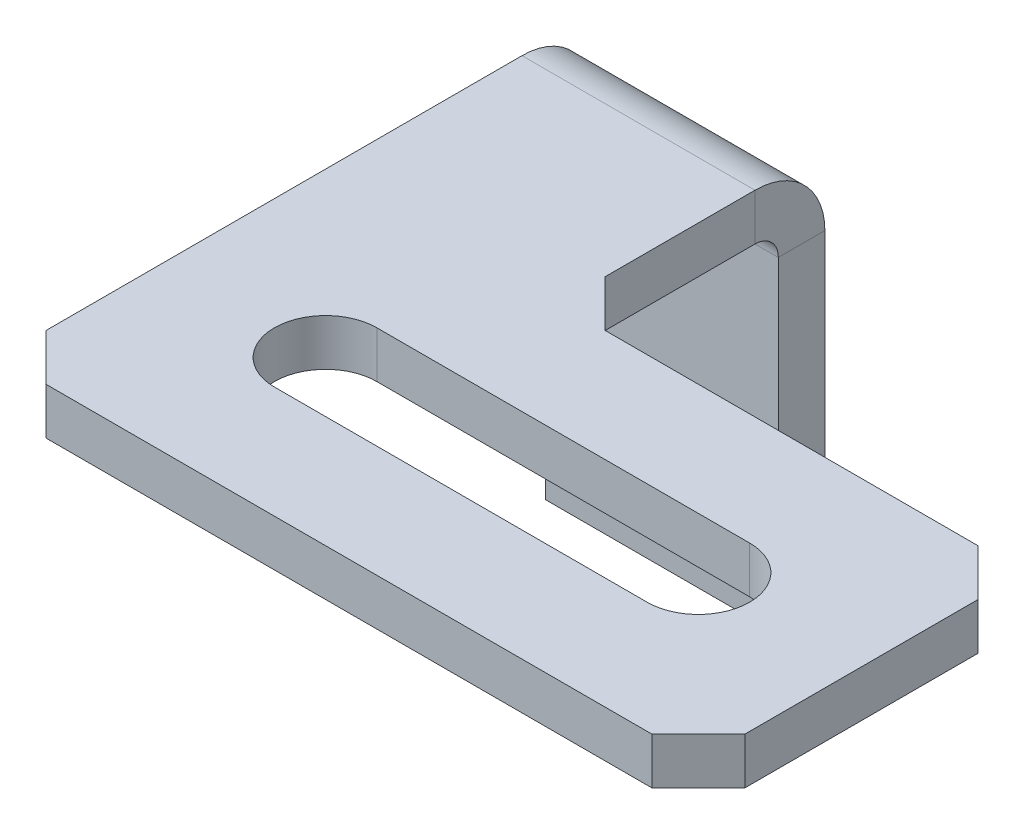
ISO-10303-21;
HEADER;
FILE_DESCRIPTION(('STEP AP214'),'2;1');
FILE_NAME('part.step','',(''),(''),'','','');
FILE_SCHEMA(('AUTOMOTIVE_DESIGN { 1 0 10303 214 1 1 1 1 }'));
ENDSEC;
DATA;
#1=APPLICATION_CONTEXT('core data for automotive mechanical design processes');
#2=APPLICATION_PROTOCOL_DEFINITION('international standard','automotive_design',2000,#1);
#3=PRODUCT_CONTEXT('',#1,'mechanical');
#4=PRODUCT('Part','Part','',(#3));
#5=PRODUCT_RELATED_PRODUCT_CATEGORY('part','',(#4));
#6=PRODUCT_DEFINITION_FORMATION('','',#4);
#7=PRODUCT_DEFINITION_CONTEXT('part definition',#1,'design');
#8=PRODUCT_DEFINITION('design','',#6,#7);
#9=PRODUCT_DEFINITION_SHAPE('','',#8);
#10=(LENGTH_UNIT() NAMED_UNIT(*) SI_UNIT(.MILLI.,.METRE.));
#11=(NAMED_UNIT(*) PLANE_ANGLE_UNIT() SI_UNIT($,.RADIAN.));
#12=(NAMED_UNIT(*) SI_UNIT($,.STERADIAN.) SOLID_ANGLE_UNIT());
#13=UNCERTAINTY_MEASURE_WITH_UNIT(LENGTH_MEASURE(1.E-05),#10,'distance_accuracy_value','');
#14=(GEOMETRIC_REPRESENTATION_CONTEXT(3) GLOBAL_UNCERTAINTY_ASSIGNED_CONTEXT((#13)) GLOBAL_UNIT_ASSIGNED_CONTEXT((#10,
#11,#12)) REPRESENTATION_CONTEXT('',''));
#15=CARTESIAN_POINT('',(0.,0.,0.));
#16=DIRECTION('',(0.,0.,1.));
#17=DIRECTION('',(1.,0.,0.));
#18=AXIS2_PLACEMENT_3D('',#15,#16,#17);
#19=CARTESIAN_POINT('',(7.5,11.2853981633974,-11.7146018366026));
#20=DIRECTION('',(0.,0.,-1.));
#21=DIRECTION('',(0.,1.,0.));
#22=AXIS2_PLACEMENT_3D('',#19,#20,#21);
#23=PLANE('',#22);
#24=DIRECTION('',(-1.,0.,0.));
#25=VECTOR('',#24,1.);
#26=CARTESIAN_POINT('',(7.5,-8.5,-11.7146018366025));
#27=LINE('',#26,#25);
#28=CARTESIAN_POINT('',(-2.5,-8.5,-11.7146018366025));
#29=VERTEX_POINT('',#28);
#30=CARTESIAN_POINT('',(-7.5,-8.5,-11.7146018366025));
#31=VERTEX_POINT('',#30);
#32=EDGE_CURVE('E141',#29,#31,#27,.T.);
#33=ORIENTED_EDGE('',*,*,#32,.F.);
#34=DIRECTION('',(0.,-1.,0.));
#35=VECTOR('',#34,1.);
#36=CARTESIAN_POINT('',(-2.5,11.2853981633974,-11.7146018366026));
#37=LINE('',#36,#35);
#38=CARTESIAN_POINT('',(-2.5,-1.5,-11.7146018366025));
#39=VERTEX_POINT('',#38);
#40=EDGE_CURVE('E149',#39,#29,#37,.T.);
#41=ORIENTED_EDGE('',*,*,#40,.F.);
#42=DIRECTION('',(-1.,0.,0.));
#43=VECTOR('',#42,1.);
#44=CARTESIAN_POINT('',(7.5,-1.5,-11.7146018366025));
#45=LINE('',#44,#43);
#46=CARTESIAN_POINT('',(-7.5,-1.5,-11.7146018366025));
#47=VERTEX_POINT('',#46);
#48=EDGE_CURVE('E166',#39,#47,#45,.T.);
#49=ORIENTED_EDGE('',*,*,#48,.T.);
#50=DIRECTION('',(0.,-1.,0.));
#51=VECTOR('',#50,1.);
#52=CARTESIAN_POINT('',(-7.5,11.2853981633974,-11.7146018366026));
#53=LINE('',#52,#51);
#54=EDGE_CURVE('E151',#47,#31,#53,.T.);
#55=ORIENTED_EDGE('',*,*,#54,.T.);
#56=EDGE_LOOP('',(#33,#41,#49,#55));
#57=FACE_BOUND('',#56,.T.);
#58=ADVANCED_FACE('F17',(#57),#23,.F.);
#59=CARTESIAN_POINT('',(7.5,11.2853981633974,-12.7146018366026));
#60=DIRECTION('',(0.,0.,-1.));
#61=DIRECTION('',(0.,1.,0.));
#62=AXIS2_PLACEMENT_3D('',#59,#60,#61);
#63=PLANE('',#62);
#64=DIRECTION('',(0.,-1.,0.));
#65=VECTOR('',#64,1.);
#66=CARTESIAN_POINT('',(-2.5,11.2853981633974,-12.7146018366026));
#67=LINE('',#66,#65);
#68=CARTESIAN_POINT('',(-2.5,-1.5,-12.7146018366025));
#69=VERTEX_POINT('',#68);
#70=CARTESIAN_POINT('',(-2.5,-8.5,-12.7146018366025));
#71=VERTEX_POINT('',#70);
#72=EDGE_CURVE('E165',#69,#71,#67,.T.);
#73=ORIENTED_EDGE('',*,*,#72,.T.);
#74=DIRECTION('',(-1.,0.,0.));
#75=VECTOR('',#74,1.);
#76=CARTESIAN_POINT('',(7.5,-8.5,-12.7146018366025));
#77=LINE('',#76,#75);
#78=CARTESIAN_POINT('',(-7.5,-8.5,-12.7146018366025));
#79=VERTEX_POINT('',#78);
#80=EDGE_CURVE('E32',#71,#79,#77,.T.);
#81=ORIENTED_EDGE('',*,*,#80,.T.);
#82=DIRECTION('',(0.,-1.,0.));
#83=VECTOR('',#82,1.);
#84=CARTESIAN_POINT('',(-7.5,-18.7146018366025,-12.7146018366025));
#85=LINE('',#84,#83);
#86=CARTESIAN_POINT('',(-7.5,-1.5,-12.7146018366025));
#87=VERTEX_POINT('',#86);
#88=EDGE_CURVE('E38',#87,#79,#85,.T.);
#89=ORIENTED_EDGE('',*,*,#88,.F.);
#90=DIRECTION('',(-1.,0.,0.));
#91=VECTOR('',#90,1.);
#92=CARTESIAN_POINT('',(7.5,-1.5,-12.7146018366025));
#93=LINE('',#92,#91);
#94=EDGE_CURVE('E170',#69,#87,#93,.T.);
#95=ORIENTED_EDGE('',*,*,#94,.F.);
#96=EDGE_LOOP('',(#73,#81,#89,#95));
#97=FACE_BOUND('',#96,.T.);
#98=ADVANCED_FACE('F332',(#97),#63,.T.);
#99=CARTESIAN_POINT('',(-7.5,-18.7146018366025,-11.7146018366025));
#100=DIRECTION('',(-1.,0.,0.));
#101=DIRECTION('',(0.,-1.,0.));
#102=AXIS2_PLACEMENT_3D('',#99,#100,#101);
#103=PLANE('',#102);
#104=ORIENTED_EDGE('',*,*,#88,.T.);
#105=DIRECTION('',(0.,0.,1.));
#106=VECTOR('',#105,1.);
#107=CARTESIAN_POINT('',(-7.5,-8.5,-11.7146018366025));
#108=LINE('',#107,#106);
#109=EDGE_CURVE('E152',#79,#31,#108,.T.);
#110=ORIENTED_EDGE('',*,*,#109,.T.);
#111=ORIENTED_EDGE('',*,*,#54,.F.);
#112=DIRECTION('',(0.,0.,1.));
#113=VECTOR('',#112,1.);
#114=CARTESIAN_POINT('',(-7.5,-1.5,-11.7146018366025));
#115=LINE('',#114,#113);
#116=EDGE_CURVE('E25',#87,#47,#115,.T.);
#117=ORIENTED_EDGE('',*,*,#116,.F.);
#118=EDGE_LOOP('',(#104,#110,#111,#117));
#119=FACE_BOUND('',#118,.T.);
#120=ADVANCED_FACE('F19',(#119),#103,.T.);
#121=CARTESIAN_POINT('',(-2.5,-18.7146018366027,-54.6595061755088));
#122=DIRECTION('',(1.,0.,0.));
#123=DIRECTION('',(0.,-1.,0.));
#124=AXIS2_PLACEMENT_3D('',#121,#122,#123);
#125=PLANE('',#124);
#126=ORIENTED_EDGE('',*,*,#40,.T.);
#127=DIRECTION('',(0.,0.,-1.));
#128=VECTOR('',#127,1.);
#129=CARTESIAN_POINT('',(-2.5,-8.5,-54.6595061755088));
#130=LINE('',#129,#128);
#131=EDGE_CURVE('E11',#29,#71,#130,.T.);
#132=ORIENTED_EDGE('',*,*,#131,.T.);
#133=ORIENTED_EDGE('',*,*,#72,.F.);
#134=DIRECTION('',(0.,0.,-1.));
#135=VECTOR('',#134,1.);
#136=CARTESIAN_POINT('',(-2.5,-1.50000000000015,-54.6595061755089));
#137=LINE('',#136,#135);
#138=EDGE_CURVE('E156',#39,#69,#137,.T.);
#139=ORIENTED_EDGE('',*,*,#138,.F.);
#140=EDGE_LOOP('',(#126,#132,#133,#139));
#141=FACE_BOUND('',#140,.T.);
#142=ADVANCED_FACE('F154',(#141),#125,.T.);
#143=CARTESIAN_POINT('',(4.,-1.,-3.5));
#144=DIRECTION('',(0.,1.,0.));
#145=DIRECTION('',(0.,0.,1.));
#146=AXIS2_PLACEMENT_3D('',#143,#144,#145);
#147=CYLINDRICAL_SURFACE('',#146,1.1);
#148=CARTESIAN_POINT('',(4.,0.,-3.5));
#149=DIRECTION('',(0.,1.,0.));
#150=DIRECTION('',(0.,0.,1.));
#151=AXIS2_PLACEMENT_3D('',#148,#149,#150);
#152=CIRCLE('',#151,1.1);
#153=CARTESIAN_POINT('',(4.,0.,-2.4));
#154=VERTEX_POINT('',#153);
#155=CARTESIAN_POINT('',(4.,0.,-4.6));
#156=VERTEX_POINT('',#155);
#157=EDGE_CURVE('E194',#154,#156,#152,.T.);
#158=ORIENTED_EDGE('',*,*,#157,.T.);
#159=DIRECTION('',(0.,1.,0.));
#160=VECTOR('',#159,1.);
#161=CARTESIAN_POINT('',(4.,-1.,-4.6));
#162=LINE('',#161,#160);
#163=CARTESIAN_POINT('',(4.,-1.,-4.6));
#164=VERTEX_POINT('',#163);
#165=EDGE_CURVE('E282',#164,#156,#162,.T.);
#166=ORIENTED_EDGE('',*,*,#165,.F.);
#167=CARTESIAN_POINT('',(4.,-1.,-3.5));
#168=DIRECTION('',(0.,1.,0.));
#169=DIRECTION('',(0.,0.,1.));
#170=AXIS2_PLACEMENT_3D('',#167,#168,#169);
#171=CIRCLE('',#170,1.1);
#172=CARTESIAN_POINT('',(4.,-1.,-2.4));
#173=VERTEX_POINT('',#172);
#174=EDGE_CURVE('E241',#173,#164,#171,.T.);
#175=ORIENTED_EDGE('',*,*,#174,.F.);
#176=DIRECTION('',(0.,1.,0.));
#177=VECTOR('',#176,1.);
#178=CARTESIAN_POINT('',(4.,-1.,-2.4));
#179=LINE('',#178,#177);
#180=EDGE_CURVE('E297',#173,#154,#179,.T.);
#181=ORIENTED_EDGE('',*,*,#180,.T.);
#182=EDGE_LOOP('',(#158,#166,#175,#181));
#183=FACE_BOUND('',#182,.T.);
#184=ADVANCED_FACE('F303',(#183),#147,.F.);
#185=CARTESIAN_POINT('',(-4.,-1.,-2.4));
#186=DIRECTION('',(0.,0.,1.));
#187=DIRECTION('',(1.,0.,0.));
#188=AXIS2_PLACEMENT_3D('',#185,#186,#187);
#189=PLANE('',#188);
#190=DIRECTION('',(1.,0.,0.));
#191=VECTOR('',#190,1.);
#192=CARTESIAN_POINT('',(-4.,-1.,-2.4));
#193=LINE('',#192,#191);
#194=CARTESIAN_POINT('',(-4.,-1.,-2.4));
#195=VERTEX_POINT('',#194);
#196=EDGE_CURVE('E244',#195,#173,#193,.T.);
#197=ORIENTED_EDGE('',*,*,#196,.F.);
#198=DIRECTION('',(0.,1.,0.));
#199=VECTOR('',#198,1.);
#200=CARTESIAN_POINT('',(-4.,-1.,-2.4));
#201=LINE('',#200,#199);
#202=CARTESIAN_POINT('',(-4.,0.,-2.4));
#203=VERTEX_POINT('',#202);
#204=EDGE_CURVE('E294',#195,#203,#201,.T.);
#205=ORIENTED_EDGE('',*,*,#204,.T.);
#206=DIRECTION('',(1.,0.,0.));
#207=VECTOR('',#206,1.);
#208=CARTESIAN_POINT('',(7.5,0.,-2.4));
#209=LINE('',#208,#207);
#210=EDGE_CURVE('E292',#203,#154,#209,.T.);
#211=ORIENTED_EDGE('',*,*,#210,.T.);
#212=ORIENTED_EDGE('',*,*,#180,.F.);
#213=EDGE_LOOP('',(#197,#205,#211,#212));
#214=FACE_BOUND('',#213,.T.);
#215=ADVANCED_FACE('F320',(#214),#189,.F.);
#216=CARTESIAN_POINT('',(-4.,-1.,-3.5));
#217=DIRECTION('',(0.,1.,0.));
#218=DIRECTION('',(0.,0.,1.));
#219=AXIS2_PLACEMENT_3D('',#216,#217,#218);
#220=CYLINDRICAL_SURFACE('',#219,1.1);
#221=CARTESIAN_POINT('',(-4.,0.,-3.5));
#222=DIRECTION('',(0.,-1.,0.));
#223=DIRECTION('',(0.,0.,1.));
#224=AXIS2_PLACEMENT_3D('',#221,#222,#223);
#225=CIRCLE('',#224,1.1);
#226=CARTESIAN_POINT('',(-4.,0.,-4.6));
#227=VERTEX_POINT('',#226);
#228=EDGE_CURVE('E229',#203,#227,#225,.T.);
#229=ORIENTED_EDGE('',*,*,#228,.F.);
#230=ORIENTED_EDGE('',*,*,#204,.F.);
#231=CARTESIAN_POINT('',(-4.,-1.,-3.5));
#232=DIRECTION('',(0.,-1.,0.));
#233=DIRECTION('',(0.,0.,1.));
#234=AXIS2_PLACEMENT_3D('',#231,#232,#233);
#235=CIRCLE('',#234,1.1);
#236=CARTESIAN_POINT('',(-4.,-1.,-4.6));
#237=VERTEX_POINT('',#236);
#238=EDGE_CURVE('E289',#195,#237,#235,.T.);
#239=ORIENTED_EDGE('',*,*,#238,.T.);
#240=DIRECTION('',(0.,1.,0.));
#241=VECTOR('',#240,1.);
#242=CARTESIAN_POINT('',(-4.,-1.,-4.6));
#243=LINE('',#242,#241);
#244=EDGE_CURVE('E286',#237,#227,#243,.T.);
#245=ORIENTED_EDGE('',*,*,#244,.T.);
#246=EDGE_LOOP('',(#229,#230,#239,#245));
#247=FACE_BOUND('',#246,.T.);
#248=ADVANCED_FACE('F314',(#247),#220,.F.);
#249=CARTESIAN_POINT('',(-4.,-1.,-4.6));
#250=DIRECTION('',(0.,0.,-1.));
#251=DIRECTION('',(-1.,0.,0.));
#252=AXIS2_PLACEMENT_3D('',#249,#250,#251);
#253=PLANE('',#252);
#254=DIRECTION('',(-1.,0.,0.));
#255=VECTOR('',#254,1.);
#256=CARTESIAN_POINT('',(-4.,0.,-4.6));
#257=LINE('',#256,#255);
#258=EDGE_CURVE('E284',#156,#227,#257,.T.);
#259=ORIENTED_EDGE('',*,*,#258,.T.);
#260=ORIENTED_EDGE('',*,*,#244,.F.);
#261=DIRECTION('',(-1.,0.,0.));
#262=VECTOR('',#261,1.);
#263=CARTESIAN_POINT('',(-4.,-1.,-4.6));
#264=LINE('',#263,#262);
#265=EDGE_CURVE('E247',#164,#237,#264,.T.);
#266=ORIENTED_EDGE('',*,*,#265,.F.);
#267=ORIENTED_EDGE('',*,*,#165,.T.);
#268=EDGE_LOOP('',(#259,#260,#266,#267));
#269=FACE_BOUND('',#268,.T.);
#270=ADVANCED_FACE('F312',(#269),#253,.F.);
#271=CARTESIAN_POINT('',(-7.5,-1.,-1.));
#272=DIRECTION('',(0.707106781186547,0.,-0.707106781186549));
#273=DIRECTION('',(-0.707106781186549,0.,-0.707106781186546));
#274=AXIS2_PLACEMENT_3D('',#271,#272,#273);
#275=PLANE('',#274);
#276=DIRECTION('',(0.707106781186549,0.,0.707106781186546));
#277=VECTOR('',#276,1.);
#278=CARTESIAN_POINT('',(-7.5,-1.,-1.));
#279=LINE('',#278,#277);
#280=CARTESIAN_POINT('',(-6.5,-1.,0.));
#281=VERTEX_POINT('',#280);
#282=CARTESIAN_POINT('',(-7.5,-1.,-1.));
#283=VERTEX_POINT('',#282);
#284=EDGE_CURVE('E251',#281,#283,#279,.F.);
#285=ORIENTED_EDGE('',*,*,#284,.F.);
#286=DIRECTION('',(0.,-1.,0.));
#287=VECTOR('',#286,1.);
#288=CARTESIAN_POINT('',(-6.5,-1.,0.));
#289=LINE('',#288,#287);
#290=CARTESIAN_POINT('',(-6.5,0.,0.));
#291=VERTEX_POINT('',#290);
#292=EDGE_CURVE('E280',#291,#281,#289,.T.);
#293=ORIENTED_EDGE('',*,*,#292,.F.);
#294=DIRECTION('',(-0.707106781186549,0.,-0.707106781186546));
#295=VECTOR('',#294,1.);
#296=CARTESIAN_POINT('',(0.50000000000003,0.,7.));
#297=LINE('',#296,#295);
#298=CARTESIAN_POINT('',(-7.5,0.,-1.00000000000002));
#299=VERTEX_POINT('',#298);
#300=EDGE_CURVE('E221',#299,#291,#297,.F.);
#301=ORIENTED_EDGE('',*,*,#300,.F.);
#302=DIRECTION('',(0.,1.,0.));
#303=VECTOR('',#302,1.);
#304=CARTESIAN_POINT('',(-7.5,-1.,-1.));
#305=LINE('',#304,#303);
#306=EDGE_CURVE('E158',#283,#299,#305,.T.);
#307=ORIENTED_EDGE('',*,*,#306,.F.);
#308=EDGE_LOOP('',(#285,#293,#301,#307));
#309=FACE_BOUND('',#308,.T.);
#310=ADVANCED_FACE('F388',(#309),#275,.F.);
#311=CARTESIAN_POINT('',(0.,-1.,0.));
#312=DIRECTION('',(0.,0.,1.));
#313=DIRECTION('',(1.,0.,0.));
#314=AXIS2_PLACEMENT_3D('',#311,#312,#313);
#315=PLANE('',#314);
#316=DIRECTION('',(1.,0.,0.));
#317=VECTOR('',#316,1.);
#318=CARTESIAN_POINT('',(0.,0.,0.));
#319=LINE('',#318,#317);
#320=CARTESIAN_POINT('',(6.5,0.,0.));
#321=VERTEX_POINT('',#320);
#322=EDGE_CURVE('E218',#291,#321,#319,.T.);
#323=ORIENTED_EDGE('',*,*,#322,.F.);
#324=ORIENTED_EDGE('',*,*,#292,.T.);
#325=DIRECTION('',(1.,0.,0.));
#326=VECTOR('',#325,1.);
#327=CARTESIAN_POINT('',(0.,-1.,0.));
#328=LINE('',#327,#326);
#329=CARTESIAN_POINT('',(6.5,-1.,0.));
#330=VERTEX_POINT('',#329);
#331=EDGE_CURVE('E277',#281,#330,#328,.T.);
#332=ORIENTED_EDGE('',*,*,#331,.T.);
#333=DIRECTION('',(0.,1.,0.));
#334=VECTOR('',#333,1.);
#335=CARTESIAN_POINT('',(6.5,-1.,0.));
#336=LINE('',#335,#334);
#337=EDGE_CURVE('E274',#330,#321,#336,.T.);
#338=ORIENTED_EDGE('',*,*,#337,.T.);
#339=EDGE_LOOP('',(#323,#324,#332,#338));
#340=FACE_BOUND('',#339,.T.);
#341=ADVANCED_FACE('F398',(#340),#315,.T.);
#342=CARTESIAN_POINT('',(6.5,-1.,0.));
#343=DIRECTION('',(-0.707106781186549,0.,-0.707106781186547));
#344=DIRECTION('',(-0.707106781186546,0.,0.707106781186549));
#345=AXIS2_PLACEMENT_3D('',#342,#343,#344);
#346=PLANE('',#345);
#347=DIRECTION('',(0.707106781186546,0.,-0.707106781186549));
#348=VECTOR('',#347,1.);
#349=CARTESIAN_POINT('',(6.5,-1.,0.));
#350=LINE('',#349,#348);
#351=CARTESIAN_POINT('',(7.5,-1.,-1.));
#352=VERTEX_POINT('',#351);
#353=EDGE_CURVE('E253',#352,#330,#350,.F.);
#354=ORIENTED_EDGE('',*,*,#353,.F.);
#355=DIRECTION('',(0.,-1.,0.));
#356=VECTOR('',#355,1.);
#357=CARTESIAN_POINT('',(7.5,-1.,-1.));
#358=LINE('',#357,#356);
#359=CARTESIAN_POINT('',(7.5,0.,-1.));
#360=VERTEX_POINT('',#359);
#361=EDGE_CURVE('E272',#360,#352,#358,.T.);
#362=ORIENTED_EDGE('',*,*,#361,.F.);
#363=DIRECTION('',(-0.707106781186546,0.,0.707106781186549));
#364=VECTOR('',#363,1.);
#365=CARTESIAN_POINT('',(7.,0.,-0.5));
#366=LINE('',#365,#364);
#367=EDGE_CURVE('E216',#321,#360,#366,.F.);
#368=ORIENTED_EDGE('',*,*,#367,.F.);
#369=ORIENTED_EDGE('',*,*,#337,.F.);
#370=EDGE_LOOP('',(#354,#362,#368,#369));
#371=FACE_BOUND('',#370,.T.);
#372=ADVANCED_FACE('F408',(#371),#346,.F.);
#373=CARTESIAN_POINT('',(7.5,-1.,-30.));
#374=DIRECTION('',(1.,0.,0.));
#375=DIRECTION('',(0.,0.,-1.));
#376=AXIS2_PLACEMENT_3D('',#373,#374,#375);
#377=PLANE('',#376);
#378=DIRECTION('',(0.,0.,-1.));
#379=VECTOR('',#378,1.);
#380=CARTESIAN_POINT('',(7.5,0.,-30.));
#381=LINE('',#380,#379);
#382=CARTESIAN_POINT('',(7.5,0.,-6.));
#383=VERTEX_POINT('',#382);
#384=EDGE_CURVE('E213',#360,#383,#381,.T.);
#385=ORIENTED_EDGE('',*,*,#384,.F.);
#386=ORIENTED_EDGE('',*,*,#361,.T.);
#387=DIRECTION('',(0.,0.,-1.));
#388=VECTOR('',#387,1.);
#389=CARTESIAN_POINT('',(7.5,-1.,0.));
#390=LINE('',#389,#388);
#391=CARTESIAN_POINT('',(7.5,-1.,-6.));
#392=VERTEX_POINT('',#391);
#393=EDGE_CURVE('E269',#352,#392,#390,.T.);
#394=ORIENTED_EDGE('',*,*,#393,.T.);
#395=DIRECTION('',(0.,1.,0.));
#396=VECTOR('',#395,1.);
#397=CARTESIAN_POINT('',(7.5,-1.,-6.));
#398=LINE('',#397,#396);
#399=EDGE_CURVE('E267',#392,#383,#398,.T.);
#400=ORIENTED_EDGE('',*,*,#399,.T.);
#401=EDGE_LOOP('',(#385,#386,#394,#400));
#402=FACE_BOUND('',#401,.T.);
#403=ADVANCED_FACE('F418',(#402),#377,.T.);
#404=CARTESIAN_POINT('',(6.5,41.9449043389063,-7.));
#405=DIRECTION('',(-0.707106781186549,0.,0.707106781186547));
#406=DIRECTION('',(0.707106781186547,0.,0.707106781186549));
#407=AXIS2_PLACEMENT_3D('',#404,#405,#406);
#408=PLANE('',#407);
#409=DIRECTION('',(0.707106781186547,0.,0.707106781186549));
#410=VECTOR('',#409,1.);
#411=CARTESIAN_POINT('',(10.5,0.,-3.));
#412=LINE('',#411,#410);
#413=CARTESIAN_POINT('',(6.5,0.,-7.));
#414=VERTEX_POINT('',#413);
#415=EDGE_CURVE('E211',#383,#414,#412,.F.);
#416=ORIENTED_EDGE('',*,*,#415,.F.);
#417=ORIENTED_EDGE('',*,*,#399,.F.);
#418=DIRECTION('',(-0.707106781186547,0.,-0.707106781186549));
#419=VECTOR('',#418,1.);
#420=CARTESIAN_POINT('',(6.5,-1.,-7.));
#421=LINE('',#420,#419);
#422=CARTESIAN_POINT('',(6.5,-1.,-7.));
#423=VERTEX_POINT('',#422);
#424=EDGE_CURVE('E255',#423,#392,#421,.F.);
#425=ORIENTED_EDGE('',*,*,#424,.F.);
#426=DIRECTION('',(0.,-1.,0.));
#427=VECTOR('',#426,1.);
#428=CARTESIAN_POINT('',(6.5,41.9449043389063,-7.));
#429=LINE('',#428,#427);
#430=EDGE_CURVE('E264',#414,#423,#429,.T.);
#431=ORIENTED_EDGE('',*,*,#430,.F.);
#432=EDGE_LOOP('',(#416,#417,#425,#431));
#433=FACE_BOUND('',#432,.T.);
#434=ADVANCED_FACE('F428',(#433),#408,.F.);
#435=CARTESIAN_POINT('',(-2.5,41.9449043389063,-7.));
#436=DIRECTION('',(0.,0.,-1.));
#437=DIRECTION('',(-1.,0.,0.));
#438=AXIS2_PLACEMENT_3D('',#435,#436,#437);
#439=PLANE('',#438);
#440=DIRECTION('',(-1.,0.,0.));
#441=VECTOR('',#440,1.);
#442=CARTESIAN_POINT('',(7.5,0.,-7.));
#443=LINE('',#442,#441);
#444=CARTESIAN_POINT('',(-1.5,0.,-7.));
#445=VERTEX_POINT('',#444);
#446=EDGE_CURVE('E208',#414,#445,#443,.T.);
#447=ORIENTED_EDGE('',*,*,#446,.F.);
#448=ORIENTED_EDGE('',*,*,#430,.T.);
#449=DIRECTION('',(-1.,0.,0.));
#450=VECTOR('',#449,1.);
#451=CARTESIAN_POINT('',(7.5,-1.,-7.));
#452=LINE('',#451,#450);
#453=CARTESIAN_POINT('',(-1.5,-1.,-7.));
#454=VERTEX_POINT('',#453);
#455=EDGE_CURVE('E261',#423,#454,#452,.T.);
#456=ORIENTED_EDGE('',*,*,#455,.T.);
#457=DIRECTION('',(0.,1.,0.));
#458=VECTOR('',#457,1.);
#459=CARTESIAN_POINT('',(-1.5,0.,-7.));
#460=LINE('',#459,#458);
#461=EDGE_CURVE('E259',#454,#445,#460,.T.);
#462=ORIENTED_EDGE('',*,*,#461,.T.);
#463=EDGE_LOOP('',(#447,#448,#456,#462));
#464=FACE_BOUND('',#463,.T.);
#465=ADVANCED_FACE('F438',(#464),#439,.T.);
#466=CARTESIAN_POINT('',(-2.5,41.9449043389063,-8.));
#467=DIRECTION('',(0.707106781186552,0.,-0.707106781186544));
#468=DIRECTION('',(-0.707106781186544,0.,-0.707106781186552));
#469=AXIS2_PLACEMENT_3D('',#466,#467,#468);
#470=PLANE('',#469);
#471=DIRECTION('',(0.707106781186544,0.,0.707106781186552));
#472=VECTOR('',#471,1.);
#473=CARTESIAN_POINT('',(-2.5,0.,-8.));
#474=LINE('',#473,#472);
#475=CARTESIAN_POINT('',(-2.5,0.,-8.));
#476=VERTEX_POINT('',#475);
#477=EDGE_CURVE('E206',#445,#476,#474,.F.);
#478=ORIENTED_EDGE('',*,*,#477,.F.);
#479=ORIENTED_EDGE('',*,*,#461,.F.);
#480=DIRECTION('',(-0.707106781186544,0.,-0.707106781186552));
#481=VECTOR('',#480,1.);
#482=CARTESIAN_POINT('',(6.5,-1.,1.00000000000004));
#483=LINE('',#482,#481);
#484=CARTESIAN_POINT('',(-2.5,-1.,-8.));
#485=VERTEX_POINT('',#484);
#486=EDGE_CURVE('E257',#485,#454,#483,.F.);
#487=ORIENTED_EDGE('',*,*,#486,.F.);
#488=DIRECTION('',(0.,-1.,0.));
#489=VECTOR('',#488,1.);
#490=CARTESIAN_POINT('',(-2.5,-1.,-8.));
#491=LINE('',#490,#489);
#492=EDGE_CURVE('E232',#476,#485,#491,.T.);
#493=ORIENTED_EDGE('',*,*,#492,.F.);
#494=EDGE_LOOP('',(#478,#479,#487,#493));
#495=FACE_BOUND('',#494,.T.);
#496=ADVANCED_FACE('F448',(#495),#470,.T.);
#497=CARTESIAN_POINT('',(7.5,-1.,0.));
#498=DIRECTION('',(0.,1.,0.));
#499=DIRECTION('',(0.,0.,1.));
#500=AXIS2_PLACEMENT_3D('',#497,#498,#499);
#501=PLANE('',#500);
#502=DIRECTION('',(-1.,0.,0.));
#503=VECTOR('',#502,1.);
#504=CARTESIAN_POINT('',(7.5,-1.,-11.2146018366025));
#505=LINE('',#504,#503);
#506=CARTESIAN_POINT('',(-2.5,-1.,-11.2146018366025));
#507=VERTEX_POINT('',#506);
#508=CARTESIAN_POINT('',(-7.5,-1.,-11.2146018366025));
#509=VERTEX_POINT('',#508);
#510=EDGE_CURVE('E173',#507,#509,#505,.T.);
#511=ORIENTED_EDGE('',*,*,#510,.F.);
#512=DIRECTION('',(0.,0.,-1.));
#513=VECTOR('',#512,1.);
#514=CARTESIAN_POINT('',(-2.5,-1.,0.));
#515=LINE('',#514,#513);
#516=EDGE_CURVE('E238',#485,#507,#515,.T.);
#517=ORIENTED_EDGE('',*,*,#516,.F.);
#518=ORIENTED_EDGE('',*,*,#486,.T.);
#519=ORIENTED_EDGE('',*,*,#455,.F.);
#520=ORIENTED_EDGE('',*,*,#424,.T.);
#521=ORIENTED_EDGE('',*,*,#393,.F.);
#522=ORIENTED_EDGE('',*,*,#353,.T.);
#523=ORIENTED_EDGE('',*,*,#331,.F.);
#524=ORIENTED_EDGE('',*,*,#284,.T.);
#525=DIRECTION('',(0.,0.,-1.));
#526=VECTOR('',#525,1.);
#527=CARTESIAN_POINT('',(-7.5,-1.,0.));
#528=LINE('',#527,#526);
#529=EDGE_CURVE('E249',#283,#509,#528,.T.);
#530=ORIENTED_EDGE('',*,*,#529,.T.);
#531=EDGE_LOOP('',(#511,#517,#518,#519,#520,#521,#522,#523,#524,#530));
#532=FACE_BOUND('',#531,.T.);
#533=ORIENTED_EDGE('',*,*,#265,.T.);
#534=ORIENTED_EDGE('',*,*,#238,.F.);
#535=ORIENTED_EDGE('',*,*,#196,.T.);
#536=ORIENTED_EDGE('',*,*,#174,.T.);
#537=EDGE_LOOP('',(#533,#534,#535,#536));
#538=FACE_BOUND('',#537,.T.);
#539=ADVANCED_FACE('F318',(#532,#538),#501,.F.);
#540=CARTESIAN_POINT('',(-2.5,41.9449043389063,-30.));
#541=DIRECTION('',(1.,0.,0.));
#542=DIRECTION('',(0.,0.,-1.));
#543=AXIS2_PLACEMENT_3D('',#540,#541,#542);
#544=PLANE('',#543);
#545=ORIENTED_EDGE('',*,*,#516,.T.);
#546=DIRECTION('',(0.,1.,0.));
#547=VECTOR('',#546,1.);
#548=CARTESIAN_POINT('',(-2.5,41.9449043389063,-11.2146018366025));
#549=LINE('',#548,#547);
#550=CARTESIAN_POINT('',(-2.5,0.,-11.2146018366025));
#551=VERTEX_POINT('',#550);
#552=EDGE_CURVE('E235',#507,#551,#549,.T.);
#553=ORIENTED_EDGE('',*,*,#552,.T.);
#554=DIRECTION('',(0.,0.,-1.));
#555=VECTOR('',#554,1.);
#556=CARTESIAN_POINT('',(-2.5,0.,0.));
#557=LINE('',#556,#555);
#558=EDGE_CURVE('E226',#476,#551,#557,.T.);
#559=ORIENTED_EDGE('',*,*,#558,.F.);
#560=ORIENTED_EDGE('',*,*,#492,.T.);
#561=EDGE_LOOP('',(#545,#553,#559,#560));
#562=FACE_BOUND('',#561,.T.);
#563=ADVANCED_FACE('F467',(#562),#544,.T.);
#564=CARTESIAN_POINT('',(7.5,0.,0.));
#565=DIRECTION('',(0.,1.,0.));
#566=DIRECTION('',(0.,0.,1.));
#567=AXIS2_PLACEMENT_3D('',#564,#565,#566);
#568=PLANE('',#567);
#569=ORIENTED_EDGE('',*,*,#228,.T.);
#570=ORIENTED_EDGE('',*,*,#258,.F.);
#571=ORIENTED_EDGE('',*,*,#157,.F.);
#572=ORIENTED_EDGE('',*,*,#210,.F.);
#573=EDGE_LOOP('',(#569,#570,#571,#572));
#574=FACE_BOUND('',#573,.T.);
#575=ORIENTED_EDGE('',*,*,#558,.T.);
#576=DIRECTION('',(-1.,0.,0.));
#577=VECTOR('',#576,1.);
#578=CARTESIAN_POINT('',(7.5,0.,-11.2146018366025));
#579=LINE('',#578,#577);
#580=CARTESIAN_POINT('',(-7.5,0.,-11.2146018366025));
#581=VERTEX_POINT('',#580);
#582=EDGE_CURVE('E223',#551,#581,#579,.T.);
#583=ORIENTED_EDGE('',*,*,#582,.T.);
#584=DIRECTION('',(0.,0.,-1.));
#585=VECTOR('',#584,1.);
#586=CARTESIAN_POINT('',(-7.5,0.,-30.));
#587=LINE('',#586,#585);
#588=EDGE_CURVE('E203',#299,#581,#587,.T.);
#589=ORIENTED_EDGE('',*,*,#588,.F.);
#590=ORIENTED_EDGE('',*,*,#300,.T.);
#591=ORIENTED_EDGE('',*,*,#322,.T.);
#592=ORIENTED_EDGE('',*,*,#367,.T.);
#593=ORIENTED_EDGE('',*,*,#384,.T.);
#594=ORIENTED_EDGE('',*,*,#415,.T.);
#595=ORIENTED_EDGE('',*,*,#446,.T.);
#596=ORIENTED_EDGE('',*,*,#477,.T.);
#597=EDGE_LOOP('',(#575,#583,#589,#590,#591,#592,#593,#594,#595,#596));
#598=FACE_BOUND('',#597,.T.);
#599=ADVANCED_FACE('F307',(#574,#598),#568,.T.);
#600=CARTESIAN_POINT('',(-7.5,-1.,-30.));
#601=DIRECTION('',(-1.,0.,0.));
#602=DIRECTION('',(0.,0.,-1.));
#603=AXIS2_PLACEMENT_3D('',#600,#601,#602);
#604=PLANE('',#603);
#605=ORIENTED_EDGE('',*,*,#588,.T.);
#606=DIRECTION('',(0.,-1.,0.));
#607=VECTOR('',#606,1.);
#608=CARTESIAN_POINT('',(-7.5,-1.,-11.2146018366025));
#609=LINE('',#608,#607);
#610=EDGE_CURVE('E162',#581,#509,#609,.T.);
#611=ORIENTED_EDGE('',*,*,#610,.T.);
#612=ORIENTED_EDGE('',*,*,#529,.F.);
#613=ORIENTED_EDGE('',*,*,#306,.T.);
#614=EDGE_LOOP('',(#605,#611,#612,#613));
#615=FACE_BOUND('',#614,.T.);
#616=ADVANCED_FACE('F340',(#615),#604,.T.);
#617=CARTESIAN_POINT('',(-2.5,-1.5,-11.2146018366025));
#618=DIRECTION('',(-1.,0.,0.));
#619=DIRECTION('',(0.,0.,1.));
#620=AXIS2_PLACEMENT_3D('',#617,#618,#619);
#621=PLANE('',#620);
#622=ORIENTED_EDGE('',*,*,#138,.T.);
#623=CARTESIAN_POINT('',(-2.5,-1.5,-11.2146018366025));
#624=DIRECTION('',(1.,0.,0.));
#625=DIRECTION('',(0.,0.,-1.));
#626=AXIS2_PLACEMENT_3D('',#623,#624,#625);
#627=CIRCLE('',#626,1.5);
#628=EDGE_CURVE('E199',#69,#551,#627,.T.);
#629=ORIENTED_EDGE('',*,*,#628,.T.);
#630=ORIENTED_EDGE('',*,*,#552,.F.);
#631=CARTESIAN_POINT('',(-2.5,-1.5,-11.2146018366025));
#632=DIRECTION('',(1.,0.,0.));
#633=DIRECTION('',(0.,0.,1.));
#634=AXIS2_PLACEMENT_3D('',#631,#632,#633);
#635=CIRCLE('',#634,0.5);
#636=EDGE_CURVE('E192',#39,#507,#635,.T.);
#637=ORIENTED_EDGE('',*,*,#636,.F.);
#638=EDGE_LOOP('',(#622,#629,#630,#637));
#639=FACE_BOUND('',#638,.T.);
#640=ADVANCED_FACE('F493',(#639),#621,.F.);
#641=CARTESIAN_POINT('',(-7.5,-1.5,-11.2146018366025));
#642=DIRECTION('',(1.,0.,0.));
#643=DIRECTION('',(0.,0.,-1.));
#644=AXIS2_PLACEMENT_3D('',#641,#642,#643);
#645=PLANE('',#644);
#646=ORIENTED_EDGE('',*,*,#610,.F.);
#647=CARTESIAN_POINT('',(-7.5,-1.5,-11.2146018366025));
#648=DIRECTION('',(1.,0.,0.));
#649=DIRECTION('',(0.,0.,-1.));
#650=AXIS2_PLACEMENT_3D('',#647,#648,#649);
#651=CIRCLE('',#650,1.5);
#652=EDGE_CURVE('E186',#581,#87,#651,.F.);
#653=ORIENTED_EDGE('',*,*,#652,.T.);
#654=ORIENTED_EDGE('',*,*,#116,.T.);
#655=CARTESIAN_POINT('',(-7.5,-1.5,-11.2146018366025));
#656=DIRECTION('',(-1.,0.,0.));
#657=DIRECTION('',(0.,0.,1.));
#658=AXIS2_PLACEMENT_3D('',#655,#656,#657);
#659=CIRCLE('',#658,0.5);
#660=EDGE_CURVE('E183',#509,#47,#659,.T.);
#661=ORIENTED_EDGE('',*,*,#660,.F.);
#662=EDGE_LOOP('',(#646,#653,#654,#661));
#663=FACE_BOUND('',#662,.T.);
#664=ADVANCED_FACE('F182',(#663),#645,.F.);
#665=CARTESIAN_POINT('',(-10.3354850857511,-1.5,-11.2146018366025));
#666=DIRECTION('',(1.,0.,0.));
#667=DIRECTION('',(0.,0.,-1.));
#668=AXIS2_PLACEMENT_3D('',#665,#666,#667);
#669=CYLINDRICAL_SURFACE('',#668,0.5);
#670=ORIENTED_EDGE('',*,*,#660,.T.);
#671=ORIENTED_EDGE('',*,*,#48,.F.);
#672=ORIENTED_EDGE('',*,*,#636,.T.);
#673=ORIENTED_EDGE('',*,*,#510,.T.);
#674=EDGE_LOOP('',(#670,#671,#672,#673));
#675=FACE_BOUND('',#674,.T.);
#676=ADVANCED_FACE('F189',(#675),#669,.F.);
#677=CARTESIAN_POINT('',(-10.3354850857511,-1.5,-11.2146018366025));
#678=DIRECTION('',(1.,0.,0.));
#679=DIRECTION('',(0.,0.,-1.));
#680=AXIS2_PLACEMENT_3D('',#677,#678,#679);
#681=CYLINDRICAL_SURFACE('',#680,1.5);
#682=ORIENTED_EDGE('',*,*,#652,.F.);
#683=ORIENTED_EDGE('',*,*,#582,.F.);
#684=ORIENTED_EDGE('',*,*,#628,.F.);
#685=ORIENTED_EDGE('',*,*,#94,.T.);
#686=EDGE_LOOP('',(#682,#683,#684,#685));
#687=FACE_BOUND('',#686,.T.);
#688=ADVANCED_FACE('F518',(#687),#681,.T.);
#689=CARTESIAN_POINT('',(3.8825896250394,-8.5,48.5755705411844));
#690=DIRECTION('',(0.,-1.,0.));
#691=DIRECTION('',(1.,0.,0.));
#692=AXIS2_PLACEMENT_3D('',#689,#690,#691);
#693=PLANE('',#692);
#694=ORIENTED_EDGE('',*,*,#109,.F.);
#695=ORIENTED_EDGE('',*,*,#80,.F.);
#696=ORIENTED_EDGE('',*,*,#131,.F.);
#697=ORIENTED_EDGE('',*,*,#32,.T.);
#698=EDGE_LOOP('',(#694,#695,#696,#697));
#699=FACE_BOUND('',#698,.T.);
#700=ADVANCED_FACE('F140',(#699),#693,.T.);
#701=CLOSED_SHELL('',(#58,#98,#120,#142,#184,#215,#248,#270,#310,#341,#372,#403,#434,#465,#496,
#539,#563,#599,#616,#640,#664,#676,#688,#700));
#702=MANIFOLD_SOLID_BREP('B1',#701);
#703=ADVANCED_BREP_SHAPE_REPRESENTATION('',(#18,#702),#14);
#704=SHAPE_DEFINITION_REPRESENTATION(#9,#703);
ENDSEC;
END-ISO-10303-21;
